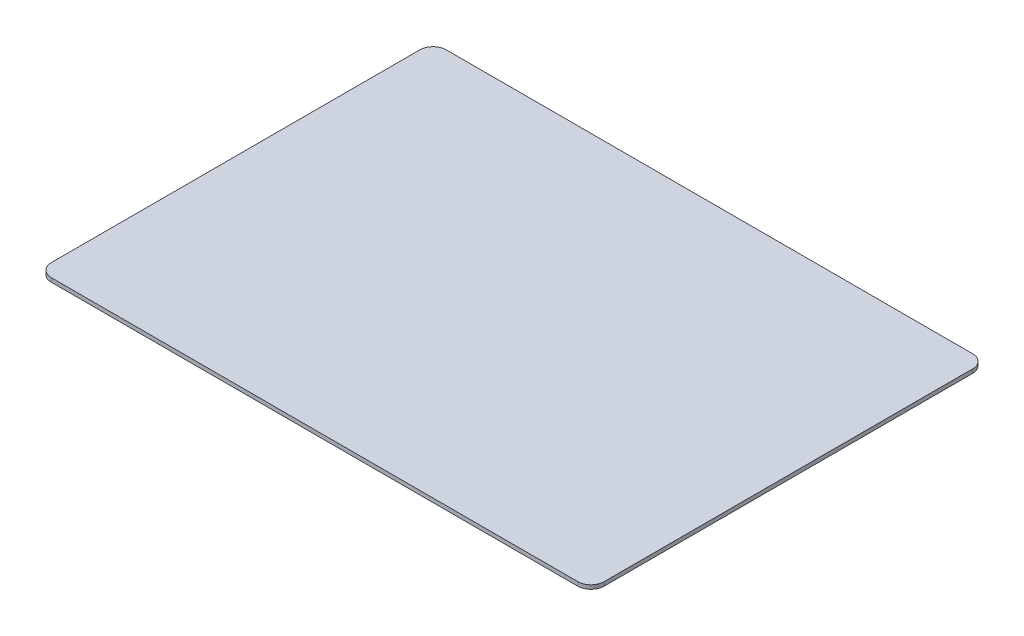
ISO-10303-21;
HEADER;
FILE_DESCRIPTION(('STEP AP214'),'2;1');
FILE_NAME('part.step','',(''),(''),'','','');
FILE_SCHEMA(('AUTOMOTIVE_DESIGN { 1 0 10303 214 1 1 1 1 }'));
ENDSEC;
DATA;
#1=APPLICATION_CONTEXT('core data for automotive mechanical design processes');
#2=APPLICATION_PROTOCOL_DEFINITION('international standard','automotive_design',2000,#1);
#3=PRODUCT_CONTEXT('',#1,'mechanical');
#4=PRODUCT('Part','Part','',(#3));
#5=PRODUCT_RELATED_PRODUCT_CATEGORY('part','',(#4));
#6=PRODUCT_DEFINITION_FORMATION('','',#4);
#7=PRODUCT_DEFINITION_CONTEXT('part definition',#1,'design');
#8=PRODUCT_DEFINITION('design','',#6,#7);
#9=PRODUCT_DEFINITION_SHAPE('','',#8);
#10=(LENGTH_UNIT() NAMED_UNIT(*) SI_UNIT(.MILLI.,.METRE.));
#11=(NAMED_UNIT(*) PLANE_ANGLE_UNIT() SI_UNIT($,.RADIAN.));
#12=(NAMED_UNIT(*) SI_UNIT($,.STERADIAN.) SOLID_ANGLE_UNIT());
#13=UNCERTAINTY_MEASURE_WITH_UNIT(LENGTH_MEASURE(1.E-05),#10,'distance_accuracy_value','');
#14=(GEOMETRIC_REPRESENTATION_CONTEXT(3) GLOBAL_UNCERTAINTY_ASSIGNED_CONTEXT((#13)) GLOBAL_UNIT_ASSIGNED_CONTEXT((#10,
#11,#12)) REPRESENTATION_CONTEXT('',''));
#15=CARTESIAN_POINT('',(0.,0.,0.));
#16=DIRECTION('',(0.,0.,1.));
#17=DIRECTION('',(1.,0.,0.));
#18=AXIS2_PLACEMENT_3D('',#15,#16,#17);
#19=CARTESIAN_POINT('',(-200.,3.,-140.));
#20=DIRECTION('',(0.,-1.,0.));
#21=DIRECTION('',(0.,0.,-1.));
#22=AXIS2_PLACEMENT_3D('',#19,#20,#21);
#23=CYLINDRICAL_SURFACE('',#22,10.);
#24=DIRECTION('',(0.,-1.,0.));
#25=VECTOR('',#24,1.);
#26=CARTESIAN_POINT('',(-210.,3.,-140.));
#27=LINE('',#26,#25);
#28=CARTESIAN_POINT('',(-210.,3.,-140.));
#29=VERTEX_POINT('',#28);
#30=CARTESIAN_POINT('',(-210.,0.,-140.));
#31=VERTEX_POINT('',#30);
#32=EDGE_CURVE('E171',#29,#31,#27,.T.);
#33=ORIENTED_EDGE('',*,*,#32,.F.);
#34=CARTESIAN_POINT('',(-200.,3.,-140.));
#35=DIRECTION('',(0.,-1.,0.));
#36=DIRECTION('',(0.,0.,-1.));
#37=AXIS2_PLACEMENT_3D('',#34,#35,#36);
#38=CIRCLE('',#37,10.);
#39=CARTESIAN_POINT('',(-200.,3.,-150.));
#40=VERTEX_POINT('',#39);
#41=EDGE_CURVE('E47',#40,#29,#38,.F.);
#42=ORIENTED_EDGE('',*,*,#41,.F.);
#43=DIRECTION('',(0.,-1.,0.));
#44=VECTOR('',#43,1.);
#45=CARTESIAN_POINT('',(-200.,3.,-150.));
#46=LINE('',#45,#44);
#47=CARTESIAN_POINT('',(-200.,0.,-150.));
#48=VERTEX_POINT('',#47);
#49=EDGE_CURVE('E175',#48,#40,#46,.F.);
#50=ORIENTED_EDGE('',*,*,#49,.F.);
#51=CARTESIAN_POINT('',(-200.,0.,-140.));
#52=DIRECTION('',(0.,-1.,0.));
#53=DIRECTION('',(0.,0.,-1.));
#54=AXIS2_PLACEMENT_3D('',#51,#52,#53);
#55=CIRCLE('',#54,10.);
#56=EDGE_CURVE('E11',#31,#48,#55,.T.);
#57=ORIENTED_EDGE('',*,*,#56,.F.);
#58=EDGE_LOOP('',(#33,#42,#50,#57));
#59=FACE_BOUND('',#58,.T.);
#60=ADVANCED_FACE('F39',(#59),#23,.T.);
#61=CARTESIAN_POINT('',(200.,3.,-140.));
#62=DIRECTION('',(0.,-1.,0.));
#63=DIRECTION('',(0.,0.,-1.));
#64=AXIS2_PLACEMENT_3D('',#61,#62,#63);
#65=CYLINDRICAL_SURFACE('',#64,10.);
#66=DIRECTION('',(0.,-1.,0.));
#67=VECTOR('',#66,1.);
#68=CARTESIAN_POINT('',(200.,3.,-150.));
#69=LINE('',#68,#67);
#70=CARTESIAN_POINT('',(200.,3.,-150.));
#71=VERTEX_POINT('',#70);
#72=CARTESIAN_POINT('',(200.,0.,-150.));
#73=VERTEX_POINT('',#72);
#74=EDGE_CURVE('E157',#71,#73,#69,.T.);
#75=ORIENTED_EDGE('',*,*,#74,.F.);
#76=CARTESIAN_POINT('',(200.,3.,-140.));
#77=DIRECTION('',(0.,-1.,0.));
#78=DIRECTION('',(0.,0.,-1.));
#79=AXIS2_PLACEMENT_3D('',#76,#77,#78);
#80=CIRCLE('',#79,10.);
#81=CARTESIAN_POINT('',(210.,3.,-140.));
#82=VERTEX_POINT('',#81);
#83=EDGE_CURVE('E165',#82,#71,#80,.F.);
#84=ORIENTED_EDGE('',*,*,#83,.F.);
#85=DIRECTION('',(0.,-1.,0.));
#86=VECTOR('',#85,1.);
#87=CARTESIAN_POINT('',(210.,3.,-140.));
#88=LINE('',#87,#86);
#89=CARTESIAN_POINT('',(210.,0.,-140.));
#90=VERTEX_POINT('',#89);
#91=EDGE_CURVE('E161',#90,#82,#88,.F.);
#92=ORIENTED_EDGE('',*,*,#91,.F.);
#93=CARTESIAN_POINT('',(200.,0.,-140.));
#94=DIRECTION('',(0.,-1.,0.));
#95=DIRECTION('',(0.,0.,-1.));
#96=AXIS2_PLACEMENT_3D('',#93,#94,#95);
#97=CIRCLE('',#96,10.);
#98=EDGE_CURVE('E168',#73,#90,#97,.T.);
#99=ORIENTED_EDGE('',*,*,#98,.F.);
#100=EDGE_LOOP('',(#75,#84,#92,#99));
#101=FACE_BOUND('',#100,.T.);
#102=ADVANCED_FACE('F203',(#101),#65,.T.);
#103=CARTESIAN_POINT('',(200.,3.,140.));
#104=DIRECTION('',(0.,-1.,0.));
#105=DIRECTION('',(0.,0.,-1.));
#106=AXIS2_PLACEMENT_3D('',#103,#104,#105);
#107=CYLINDRICAL_SURFACE('',#106,10.);
#108=DIRECTION('',(0.,-1.,0.));
#109=VECTOR('',#108,1.);
#110=CARTESIAN_POINT('',(210.,3.,140.));
#111=LINE('',#110,#109);
#112=CARTESIAN_POINT('',(210.,3.,140.));
#113=VERTEX_POINT('',#112);
#114=CARTESIAN_POINT('',(210.,0.,140.));
#115=VERTEX_POINT('',#114);
#116=EDGE_CURVE('E113',#113,#115,#111,.T.);
#117=ORIENTED_EDGE('',*,*,#116,.F.);
#118=CARTESIAN_POINT('',(200.,3.,140.));
#119=DIRECTION('',(0.,-1.,0.));
#120=DIRECTION('',(0.,0.,-1.));
#121=AXIS2_PLACEMENT_3D('',#118,#119,#120);
#122=CIRCLE('',#121,10.);
#123=CARTESIAN_POINT('',(200.,3.,150.));
#124=VERTEX_POINT('',#123);
#125=EDGE_CURVE('E152',#124,#113,#122,.F.);
#126=ORIENTED_EDGE('',*,*,#125,.F.);
#127=DIRECTION('',(0.,-1.,0.));
#128=VECTOR('',#127,1.);
#129=CARTESIAN_POINT('',(200.,3.,150.));
#130=LINE('',#129,#128);
#131=CARTESIAN_POINT('',(200.,0.,150.));
#132=VERTEX_POINT('',#131);
#133=EDGE_CURVE('E149',#132,#124,#130,.F.);
#134=ORIENTED_EDGE('',*,*,#133,.F.);
#135=CARTESIAN_POINT('',(200.,0.,140.));
#136=DIRECTION('',(0.,-1.,0.));
#137=DIRECTION('',(0.,0.,-1.));
#138=AXIS2_PLACEMENT_3D('',#135,#136,#137);
#139=CIRCLE('',#138,10.);
#140=EDGE_CURVE('E127',#115,#132,#139,.T.);
#141=ORIENTED_EDGE('',*,*,#140,.F.);
#142=EDGE_LOOP('',(#117,#126,#134,#141));
#143=FACE_BOUND('',#142,.T.);
#144=ADVANCED_FACE('F209',(#143),#107,.T.);
#145=CARTESIAN_POINT('',(-200.,3.,140.));
#146=DIRECTION('',(0.,-1.,0.));
#147=DIRECTION('',(0.,0.,-1.));
#148=AXIS2_PLACEMENT_3D('',#145,#146,#147);
#149=CYLINDRICAL_SURFACE('',#148,10.);
#150=DIRECTION('',(0.,-1.,0.));
#151=VECTOR('',#150,1.);
#152=CARTESIAN_POINT('',(-200.,3.,150.));
#153=LINE('',#152,#151);
#154=CARTESIAN_POINT('',(-200.,3.,150.));
#155=VERTEX_POINT('',#154);
#156=CARTESIAN_POINT('',(-200.,0.,150.));
#157=VERTEX_POINT('',#156);
#158=EDGE_CURVE('E107',#155,#157,#153,.T.);
#159=ORIENTED_EDGE('',*,*,#158,.F.);
#160=CARTESIAN_POINT('',(-200.,3.,140.));
#161=DIRECTION('',(0.,-1.,0.));
#162=DIRECTION('',(0.,0.,-1.));
#163=AXIS2_PLACEMENT_3D('',#160,#161,#162);
#164=CIRCLE('',#163,10.);
#165=CARTESIAN_POINT('',(-210.,3.,140.));
#166=VERTEX_POINT('',#165);
#167=EDGE_CURVE('E114',#166,#155,#164,.F.);
#168=ORIENTED_EDGE('',*,*,#167,.F.);
#169=DIRECTION('',(0.,-1.,0.));
#170=VECTOR('',#169,1.);
#171=CARTESIAN_POINT('',(-210.,3.,140.));
#172=LINE('',#171,#170);
#173=CARTESIAN_POINT('',(-210.,0.,140.));
#174=VERTEX_POINT('',#173);
#175=EDGE_CURVE('E110',#174,#166,#172,.F.);
#176=ORIENTED_EDGE('',*,*,#175,.F.);
#177=CARTESIAN_POINT('',(-200.,0.,140.));
#178=DIRECTION('',(0.,-1.,0.));
#179=DIRECTION('',(0.,0.,-1.));
#180=AXIS2_PLACEMENT_3D('',#177,#178,#179);
#181=CIRCLE('',#180,10.);
#182=EDGE_CURVE('E103',#157,#174,#181,.T.);
#183=ORIENTED_EDGE('',*,*,#182,.F.);
#184=EDGE_LOOP('',(#159,#168,#176,#183));
#185=FACE_BOUND('',#184,.T.);
#186=ADVANCED_FACE('F105',(#185),#149,.T.);
#187=CARTESIAN_POINT('',(210.,3.,150.));
#188=DIRECTION('',(-1.,0.,0.));
#189=DIRECTION('',(0.,0.,1.));
#190=AXIS2_PLACEMENT_3D('',#187,#188,#189);
#191=PLANE('',#190);
#192=DIRECTION('',(0.,0.,-1.));
#193=VECTOR('',#192,1.);
#194=CARTESIAN_POINT('',(210.,0.,150.));
#195=LINE('',#194,#193);
#196=EDGE_CURVE('E193',#115,#90,#195,.T.);
#197=ORIENTED_EDGE('',*,*,#196,.T.);
#198=ORIENTED_EDGE('',*,*,#91,.T.);
#199=DIRECTION('',(0.,0.,-1.));
#200=VECTOR('',#199,1.);
#201=CARTESIAN_POINT('',(210.,3.,150.));
#202=LINE('',#201,#200);
#203=EDGE_CURVE('E130',#113,#82,#202,.T.);
#204=ORIENTED_EDGE('',*,*,#203,.F.);
#205=ORIENTED_EDGE('',*,*,#116,.T.);
#206=EDGE_LOOP('',(#197,#198,#204,#205));
#207=FACE_BOUND('',#206,.T.);
#208=ADVANCED_FACE('F206',(#207),#191,.F.);
#209=CARTESIAN_POINT('',(-210.,3.,-150.));
#210=DIRECTION('',(0.,0.,1.));
#211=DIRECTION('',(1.,0.,0.));
#212=AXIS2_PLACEMENT_3D('',#209,#210,#211);
#213=PLANE('',#212);
#214=DIRECTION('',(-1.,0.,0.));
#215=VECTOR('',#214,1.);
#216=CARTESIAN_POINT('',(-210.,0.,-150.));
#217=LINE('',#216,#215);
#218=EDGE_CURVE('E138',#73,#48,#217,.T.);
#219=ORIENTED_EDGE('',*,*,#218,.T.);
#220=ORIENTED_EDGE('',*,*,#49,.T.);
#221=DIRECTION('',(-1.,0.,0.));
#222=VECTOR('',#221,1.);
#223=CARTESIAN_POINT('',(-210.,3.,-150.));
#224=LINE('',#223,#222);
#225=EDGE_CURVE('E136',#71,#40,#224,.T.);
#226=ORIENTED_EDGE('',*,*,#225,.F.);
#227=ORIENTED_EDGE('',*,*,#74,.T.);
#228=EDGE_LOOP('',(#219,#220,#226,#227));
#229=FACE_BOUND('',#228,.T.);
#230=ADVANCED_FACE('F199',(#229),#213,.F.);
#231=CARTESIAN_POINT('',(-210.,3.,150.));
#232=DIRECTION('',(1.,0.,0.));
#233=DIRECTION('',(0.,0.,-1.));
#234=AXIS2_PLACEMENT_3D('',#231,#232,#233);
#235=PLANE('',#234);
#236=DIRECTION('',(0.,0.,1.));
#237=VECTOR('',#236,1.);
#238=CARTESIAN_POINT('',(-210.,3.,150.));
#239=LINE('',#238,#237);
#240=EDGE_CURVE('E182',#29,#166,#239,.T.);
#241=ORIENTED_EDGE('',*,*,#240,.F.);
#242=ORIENTED_EDGE('',*,*,#32,.T.);
#243=DIRECTION('',(0.,0.,1.));
#244=VECTOR('',#243,1.);
#245=CARTESIAN_POINT('',(-210.,0.,150.));
#246=LINE('',#245,#244);
#247=EDGE_CURVE('E131',#31,#174,#246,.T.);
#248=ORIENTED_EDGE('',*,*,#247,.T.);
#249=ORIENTED_EDGE('',*,*,#175,.T.);
#250=EDGE_LOOP('',(#241,#242,#248,#249));
#251=FACE_BOUND('',#250,.T.);
#252=ADVANCED_FACE('F185',(#251),#235,.F.);
#253=CARTESIAN_POINT('',(-210.,3.,150.));
#254=DIRECTION('',(0.,0.,-1.));
#255=DIRECTION('',(-1.,0.,0.));
#256=AXIS2_PLACEMENT_3D('',#253,#254,#255);
#257=PLANE('',#256);
#258=DIRECTION('',(1.,0.,0.));
#259=VECTOR('',#258,1.);
#260=CARTESIAN_POINT('',(-210.,0.,150.));
#261=LINE('',#260,#259);
#262=EDGE_CURVE('E120',#157,#132,#261,.T.);
#263=ORIENTED_EDGE('',*,*,#262,.T.);
#264=ORIENTED_EDGE('',*,*,#133,.T.);
#265=DIRECTION('',(1.,0.,0.));
#266=VECTOR('',#265,1.);
#267=CARTESIAN_POINT('',(-210.,3.,150.));
#268=LINE('',#267,#266);
#269=EDGE_CURVE('E122',#155,#124,#268,.T.);
#270=ORIENTED_EDGE('',*,*,#269,.F.);
#271=ORIENTED_EDGE('',*,*,#158,.T.);
#272=EDGE_LOOP('',(#263,#264,#270,#271));
#273=FACE_BOUND('',#272,.T.);
#274=ADVANCED_FACE('F118',(#273),#257,.F.);
#275=CARTESIAN_POINT('',(0.,3.,0.));
#276=DIRECTION('',(0.,-1.,0.));
#277=DIRECTION('',(0.,0.,-1.));
#278=AXIS2_PLACEMENT_3D('',#275,#276,#277);
#279=PLANE('',#278);
#280=ORIENTED_EDGE('',*,*,#225,.T.);
#281=ORIENTED_EDGE('',*,*,#41,.T.);
#282=ORIENTED_EDGE('',*,*,#240,.T.);
#283=ORIENTED_EDGE('',*,*,#167,.T.);
#284=ORIENTED_EDGE('',*,*,#269,.T.);
#285=ORIENTED_EDGE('',*,*,#125,.T.);
#286=ORIENTED_EDGE('',*,*,#203,.T.);
#287=ORIENTED_EDGE('',*,*,#83,.T.);
#288=EDGE_LOOP('',(#280,#281,#282,#283,#284,#285,#286,#287));
#289=FACE_BOUND('',#288,.T.);
#290=ADVANCED_FACE('F180',(#289),#279,.F.);
#291=CARTESIAN_POINT('',(0.,0.,0.));
#292=DIRECTION('',(0.,-1.,0.));
#293=DIRECTION('',(0.,0.,-1.));
#294=AXIS2_PLACEMENT_3D('',#291,#292,#293);
#295=PLANE('',#294);
#296=ORIENTED_EDGE('',*,*,#247,.F.);
#297=ORIENTED_EDGE('',*,*,#56,.T.);
#298=ORIENTED_EDGE('',*,*,#218,.F.);
#299=ORIENTED_EDGE('',*,*,#98,.T.);
#300=ORIENTED_EDGE('',*,*,#196,.F.);
#301=ORIENTED_EDGE('',*,*,#140,.T.);
#302=ORIENTED_EDGE('',*,*,#262,.F.);
#303=ORIENTED_EDGE('',*,*,#182,.T.);
#304=EDGE_LOOP('',(#296,#297,#298,#299,#300,#301,#302,#303));
#305=FACE_BOUND('',#304,.T.);
#306=ADVANCED_FACE('F125',(#305),#295,.T.);
#307=CLOSED_SHELL('',(#60,#102,#144,#186,#208,#230,#252,#274,#290,#306));
#308=MANIFOLD_SOLID_BREP('B2',#307);
#309=ADVANCED_BREP_SHAPE_REPRESENTATION('',(#18,#308),#14);
#310=SHAPE_DEFINITION_REPRESENTATION(#9,#309);
ENDSEC;
END-ISO-10303-21;
